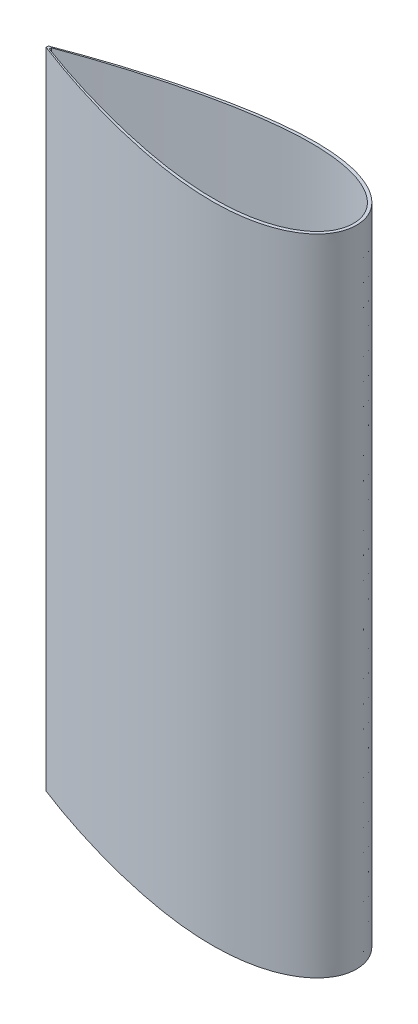
ISO-10303-21;
HEADER;
FILE_DESCRIPTION(('STEP AP214'),'2;1');
FILE_NAME('part.step','',(''),(''),'','','');
FILE_SCHEMA(('AUTOMOTIVE_DESIGN { 1 0 10303 214 1 1 1 1 }'));
ENDSEC;
DATA;
#1=APPLICATION_CONTEXT('core data for automotive mechanical design processes');
#2=APPLICATION_PROTOCOL_DEFINITION('international standard','automotive_design',2000,#1);
#3=PRODUCT_CONTEXT('',#1,'mechanical');
#4=PRODUCT('Part','Part','',(#3));
#5=PRODUCT_RELATED_PRODUCT_CATEGORY('part','',(#4));
#6=PRODUCT_DEFINITION_FORMATION('','',#4);
#7=PRODUCT_DEFINITION_CONTEXT('part definition',#1,'design');
#8=PRODUCT_DEFINITION('design','',#6,#7);
#9=PRODUCT_DEFINITION_SHAPE('','',#8);
#10=(LENGTH_UNIT() NAMED_UNIT(*) SI_UNIT(.MILLI.,.METRE.));
#11=(NAMED_UNIT(*) PLANE_ANGLE_UNIT() SI_UNIT($,.RADIAN.));
#12=(NAMED_UNIT(*) SI_UNIT($,.STERADIAN.) SOLID_ANGLE_UNIT());
#13=UNCERTAINTY_MEASURE_WITH_UNIT(LENGTH_MEASURE(1.E-05),#10,'distance_accuracy_value','');
#14=(GEOMETRIC_REPRESENTATION_CONTEXT(3) GLOBAL_UNCERTAINTY_ASSIGNED_CONTEXT((#13)) GLOBAL_UNIT_ASSIGNED_CONTEXT((#10,
#11,#12)) REPRESENTATION_CONTEXT('',''));
#15=CARTESIAN_POINT('',(0.,0.,0.));
#16=DIRECTION('',(0.,0.,1.));
#17=DIRECTION('',(1.,0.,0.));
#18=AXIS2_PLACEMENT_3D('',#15,#16,#17);
#19=CARTESIAN_POINT('',(-57.12,170.,0.285599999999995));
#20=CARTESIAN_POINT('',(-57.0455040447807,170.,0.314604205867027));
#21=CARTESIAN_POINT('',(-56.7485323708372,170.,0.430226960718439));
#22=CARTESIAN_POINT('',(-56.0834370859312,170.,0.687194926915187));
#23=CARTESIAN_POINT('',(-54.9830203449286,170.,1.10687746532345));
#24=CARTESIAN_POINT('',(-53.4591845655172,170.,1.67669100241537));
#25=CARTESIAN_POINT('',(-51.5285513298831,170.,2.38051048545914));
#26=CARTESIAN_POINT('',(-49.2121785972268,170.,3.19931332469481));
#27=CARTESIAN_POINT('',(-46.535401215014,170.,4.11224662244061));
#28=CARTESIAN_POINT('',(-43.5275397758018,170.,5.09732240051492));
#29=CARTESIAN_POINT('',(-40.2215821282518,170.,6.13190197270472));
#30=CARTESIAN_POINT('',(-36.6538039132951,170.,7.19283446637181));
#31=CARTESIAN_POINT('',(-32.8633476184003,170.,8.25632005064995));
#32=CARTESIAN_POINT('',(-28.8917637696992,170.,9.29759406218048));
#33=CARTESIAN_POINT('',(-24.7825243702763,170.,10.2905925714493));
#34=CARTESIAN_POINT('',(-20.5805179123394,170.,11.2077747794619));
#35=CARTESIAN_POINT('',(-16.3315368977414,170.,12.0202624725636));
#36=CARTESIAN_POINT('',(-12.0817693396444,170.,12.6984059872374));
#37=CARTESIAN_POINT('',(-7.87730513730122,170.,13.2128105385158));
#38=CARTESIAN_POINT('',(-3.7636652033935,170.,13.5357689250191));
#39=CARTESIAN_POINT('',(0.214645026823543,170.,13.642961665452));
#40=CARTESIAN_POINT('',(4.01456576560963,170.,13.5152167016279));
#41=CARTESIAN_POINT('',(7.59491598504345,170.,13.1400762984829));
#42=CARTESIAN_POINT('',(10.9168552641477,170.,12.5129021529628));
#43=CARTESIAN_POINT('',(13.9443886791298,170.,11.6372600366361));
#44=CARTESIAN_POINT('',(16.644881453109,170.,10.5243729582214));
#45=CARTESIAN_POINT('',(18.9894392117263,170.,9.19152180457931));
#46=CARTESIAN_POINT('',(20.9528399339452,170.,7.65953057210412));
#47=CARTESIAN_POINT('',(22.5125195427664,170.,5.94987780799117));
#48=CARTESIAN_POINT('',(23.6466567135729,170.,4.08331642952162));
#49=CARTESIAN_POINT('',(24.3333719851233,170.,2.08091678950326));
#50=CARTESIAN_POINT('',(24.5534114796255,170.,0.));
#51=CARTESIAN_POINT('',(24.3333719851234,170.,-2.08091678950323));
#52=CARTESIAN_POINT('',(23.6466567135729,170.,-4.08331642952163));
#53=CARTESIAN_POINT('',(22.5125195427664,170.,-5.94987780799118));
#54=CARTESIAN_POINT('',(20.9528399339452,170.,-7.65953057210411));
#55=CARTESIAN_POINT('',(18.9894392117263,170.,-9.19152180457931));
#56=CARTESIAN_POINT('',(16.644881453109,170.,-10.5243729582214));
#57=CARTESIAN_POINT('',(13.9443886791298,170.,-11.6372600366361));
#58=CARTESIAN_POINT('',(10.9168552641477,170.,-12.5129021529628));
#59=CARTESIAN_POINT('',(7.59491598504344,170.,-13.1400762984829));
#60=CARTESIAN_POINT('',(4.01456576560963,170.,-13.5152167016279));
#61=CARTESIAN_POINT('',(0.214645026823549,170.,-13.642961665452));
#62=CARTESIAN_POINT('',(-3.76366520339349,170.,-13.5357689250191));
#63=CARTESIAN_POINT('',(-7.87730513730124,170.,-13.2128105385158));
#64=CARTESIAN_POINT('',(-12.0817693396444,170.,-12.6984059872374));
#65=CARTESIAN_POINT('',(-16.3315368977414,170.,-12.0202624725636));
#66=CARTESIAN_POINT('',(-20.5805179123394,170.,-11.2077747794619));
#67=CARTESIAN_POINT('',(-24.7825243702763,170.,-10.2905925714493));
#68=CARTESIAN_POINT('',(-28.8917637696992,170.,-9.29759406218048));
#69=CARTESIAN_POINT('',(-32.8633476184003,170.,-8.25632005064995));
#70=CARTESIAN_POINT('',(-36.6538039132951,170.,-7.19283446637181));
#71=CARTESIAN_POINT('',(-40.2215821282518,170.,-6.13190197270473));
#72=CARTESIAN_POINT('',(-43.5275397758018,170.,-5.09732240051492));
#73=CARTESIAN_POINT('',(-46.535401215014,170.,-4.11224662244061));
#74=CARTESIAN_POINT('',(-49.2121785972268,170.,-3.1993133246948));
#75=CARTESIAN_POINT('',(-51.5285513298831,170.,-2.38051048545915));
#76=CARTESIAN_POINT('',(-53.4591845655172,170.,-1.67669100241537));
#77=CARTESIAN_POINT('',(-54.9830203449286,170.,-1.10687746532345));
#78=CARTESIAN_POINT('',(-56.0834370859312,170.,-0.687194926915175));
#79=CARTESIAN_POINT('',(-56.7485323708371,170.,-0.430226960718449));
#80=CARTESIAN_POINT('',(-57.0455040447808,170.,-0.314604205867027));
#81=CARTESIAN_POINT('',(-57.12,170.,-0.285599999999995));
#82=B_SPLINE_CURVE_WITH_KNOTS('',3,(#19,#20,#21,#22,#23,#24,#25,#26,#27,#28,#29,#30,#31,#32,#33,
#34,#35,#36,#37,#38,#39,#40,#41,#42,#43,#44,#45,#46,#47,#48,#49,#50,#51,#52,#53,#54,#55,#56,#57,
#58,#59,#60,#61,#62,#63,#64,#65,#66,#67,#68,#69,#70,#71,#72,#73,#74,#75,#76,#77,#78,#79,#80,
#81),.UNSPECIFIED.,.F.,.F.,(4,1,1,1,1,1,1,1,1,1,1,1,1,1,1,1,1,1,1,1,1,1,1,1,1,1,1,1,1,1,1,1,1,1,
1,1,1,1,1,1,1,1,1,1,1,1,1,1,1,1,1,1,1,1,1,1,1,1,1,1,4),(0.,0.00133550320219677,
0.00532386785760586,0.0119113049159635,0.0210102102683999,0.032501881486354,0.0462397187536872,
0.0620525024401402,0.0797474334350778,0.0991127820118181,0.119920173065211,0.141926699741709,
0.164877175844241,0.188506894471238,0.212545246994764,0.236720464663743,0.260765569827729,
0.284425373073179,0.307464060759566,0.329672653470025,0.350875479931116,0.370934915548274,
0.389754069606793,0.407277888700062,0.423494169030857,0.438436954355053,0.452195212433233,
0.464928581335463,0.476887756585074,0.488428514237328,0.5,0.511571485762672,0.523112243414925,
0.535071418664537,0.547804787566767,0.561563045644947,0.576505830969143,0.592722111299938,
0.610245930393206,0.629065084451725,0.649124520068884,0.670327346529975,0.692535939240434,
0.71557462692682,0.739234430172271,0.763279535336257,0.787454753005236,0.811493105528761,
0.835122824155759,0.85807330025829,0.880079826934789,0.900887217988182,0.920252566564922,
0.93794749755986,0.953760281246313,0.967498118513646,0.9789897897316,0.988088695084037,
0.994676132142394,0.998664496797803,1.),.UNSPECIFIED.);
#83=DIRECTION('',(0.,-1.,0.));
#84=VECTOR('',#83,1.);
#85=SURFACE_OF_LINEAR_EXTRUSION('',#82,#84);
#86=CARTESIAN_POINT('',(-57.12,0.,0.285599999999995));
#87=CARTESIAN_POINT('',(-57.0455040447807,0.,0.314604205867027));
#88=CARTESIAN_POINT('',(-56.7485323708372,0.,0.430226960718439));
#89=CARTESIAN_POINT('',(-56.0834370859312,0.,0.687194926915187));
#90=CARTESIAN_POINT('',(-54.9830203449286,0.,1.10687746532345));
#91=CARTESIAN_POINT('',(-53.4591845655172,0.,1.67669100241537));
#92=CARTESIAN_POINT('',(-51.5285513298831,0.,2.38051048545914));
#93=CARTESIAN_POINT('',(-49.2121785972268,0.,3.19931332469481));
#94=CARTESIAN_POINT('',(-46.535401215014,0.,4.11224662244061));
#95=CARTESIAN_POINT('',(-43.5275397758018,0.,5.09732240051492));
#96=CARTESIAN_POINT('',(-40.2215821282518,0.,6.13190197270472));
#97=CARTESIAN_POINT('',(-36.6538039132951,0.,7.19283446637181));
#98=CARTESIAN_POINT('',(-32.8633476184003,0.,8.25632005064995));
#99=CARTESIAN_POINT('',(-28.8917637696992,0.,9.29759406218048));
#100=CARTESIAN_POINT('',(-24.7825243702763,0.,10.2905925714493));
#101=CARTESIAN_POINT('',(-20.5805179123394,0.,11.2077747794619));
#102=CARTESIAN_POINT('',(-16.3315368977414,0.,12.0202624725636));
#103=CARTESIAN_POINT('',(-12.0817693396444,0.,12.6984059872374));
#104=CARTESIAN_POINT('',(-7.87730513730122,0.,13.2128105385158));
#105=CARTESIAN_POINT('',(-3.7636652033935,0.,13.5357689250191));
#106=CARTESIAN_POINT('',(0.214645026823543,0.,13.642961665452));
#107=CARTESIAN_POINT('',(4.01456576560963,0.,13.5152167016279));
#108=CARTESIAN_POINT('',(7.59491598504345,0.,13.1400762984829));
#109=CARTESIAN_POINT('',(10.9168552641477,0.,12.5129021529628));
#110=CARTESIAN_POINT('',(13.9443886791298,0.,11.6372600366361));
#111=CARTESIAN_POINT('',(16.644881453109,0.,10.5243729582214));
#112=CARTESIAN_POINT('',(18.9894392117263,0.,9.19152180457931));
#113=CARTESIAN_POINT('',(20.9528399339452,0.,7.65953057210412));
#114=CARTESIAN_POINT('',(22.5125195427664,0.,5.94987780799117));
#115=CARTESIAN_POINT('',(23.6466567135729,0.,4.08331642952162));
#116=CARTESIAN_POINT('',(24.3333719851233,0.,2.08091678950326));
#117=CARTESIAN_POINT('',(24.5534114796255,0.,0.));
#118=CARTESIAN_POINT('',(24.3333719851234,0.,-2.08091678950323));
#119=CARTESIAN_POINT('',(23.6466567135729,0.,-4.08331642952163));
#120=CARTESIAN_POINT('',(22.5125195427664,0.,-5.94987780799118));
#121=CARTESIAN_POINT('',(20.9528399339452,0.,-7.65953057210411));
#122=CARTESIAN_POINT('',(18.9894392117263,0.,-9.19152180457931));
#123=CARTESIAN_POINT('',(16.644881453109,0.,-10.5243729582214));
#124=CARTESIAN_POINT('',(13.9443886791298,0.,-11.6372600366361));
#125=CARTESIAN_POINT('',(10.9168552641477,0.,-12.5129021529628));
#126=CARTESIAN_POINT('',(7.59491598504344,0.,-13.1400762984829));
#127=CARTESIAN_POINT('',(4.01456576560963,0.,-13.5152167016279));
#128=CARTESIAN_POINT('',(0.214645026823549,0.,-13.642961665452));
#129=CARTESIAN_POINT('',(-3.76366520339349,0.,-13.5357689250191));
#130=CARTESIAN_POINT('',(-7.87730513730124,0.,-13.2128105385158));
#131=CARTESIAN_POINT('',(-12.0817693396444,0.,-12.6984059872374));
#132=CARTESIAN_POINT('',(-16.3315368977414,0.,-12.0202624725636));
#133=CARTESIAN_POINT('',(-20.5805179123394,0.,-11.2077747794619));
#134=CARTESIAN_POINT('',(-24.7825243702763,0.,-10.2905925714493));
#135=CARTESIAN_POINT('',(-28.8917637696992,0.,-9.29759406218048));
#136=CARTESIAN_POINT('',(-32.8633476184003,0.,-8.25632005064995));
#137=CARTESIAN_POINT('',(-36.6538039132951,0.,-7.19283446637181));
#138=CARTESIAN_POINT('',(-40.2215821282518,0.,-6.13190197270473));
#139=CARTESIAN_POINT('',(-43.5275397758018,0.,-5.09732240051492));
#140=CARTESIAN_POINT('',(-46.535401215014,0.,-4.11224662244061));
#141=CARTESIAN_POINT('',(-49.2121785972268,0.,-3.1993133246948));
#142=CARTESIAN_POINT('',(-51.5285513298831,0.,-2.38051048545915));
#143=CARTESIAN_POINT('',(-53.4591845655172,0.,-1.67669100241537));
#144=CARTESIAN_POINT('',(-54.9830203449286,0.,-1.10687746532345));
#145=CARTESIAN_POINT('',(-56.0834370859312,0.,-0.687194926915175));
#146=CARTESIAN_POINT('',(-56.7485323708371,0.,-0.430226960718449));
#147=CARTESIAN_POINT('',(-57.0455040447808,0.,-0.314604205867027));
#148=CARTESIAN_POINT('',(-57.12,0.,-0.285599999999995));
#149=B_SPLINE_CURVE_WITH_KNOTS('',3,(#86,#87,#88,#89,#90,#91,#92,#93,#94,#95,#96,#97,#98,#99,
#100,#101,#102,#103,#104,#105,#106,#107,#108,#109,#110,#111,#112,#113,#114,#115,#116,#117,#118,
#119,#120,#121,#122,#123,#124,#125,#126,#127,#128,#129,#130,#131,#132,#133,#134,#135,#136,#137,
#138,#139,#140,#141,#142,#143,#144,#145,#146,#147,#148),.UNSPECIFIED.,.F.,.F.,(4,1,1,1,1,1,1,1,
1,1,1,1,1,1,1,1,1,1,1,1,1,1,1,1,1,1,1,1,1,1,1,1,1,1,1,1,1,1,1,1,1,1,1,1,1,1,1,1,1,1,1,1,1,1,1,1,
1,1,1,1,4),(0.,0.00133550320219677,0.00532386785760586,0.0119113049159635,0.0210102102683999,
0.032501881486354,0.0462397187536872,0.0620525024401402,0.0797474334350778,0.0991127820118181,
0.119920173065211,0.141926699741709,0.164877175844241,0.188506894471238,0.212545246994764,
0.236720464663743,0.260765569827729,0.284425373073179,0.307464060759566,0.329672653470025,
0.350875479931116,0.370934915548274,0.389754069606793,0.407277888700062,0.423494169030857,
0.438436954355053,0.452195212433233,0.464928581335463,0.476887756585074,0.488428514237328,0.5,
0.511571485762672,0.523112243414925,0.535071418664537,0.547804787566767,0.561563045644947,
0.576505830969143,0.592722111299938,0.610245930393206,0.629065084451725,0.649124520068884,
0.670327346529975,0.692535939240434,0.71557462692682,0.739234430172271,0.763279535336257,
0.787454753005236,0.811493105528761,0.835122824155759,0.85807330025829,0.880079826934789,
0.900887217988182,0.920252566564922,0.93794749755986,0.953760281246313,0.967498118513646,
0.9789897897316,0.988088695084037,0.994676132142394,0.998664496797803,1.),.UNSPECIFIED.);
#150=CARTESIAN_POINT('',(-57.12,0.,0.285599999999995));
#151=VERTEX_POINT('',#150);
#152=CARTESIAN_POINT('',(-57.12,0.,-0.285599999999995));
#153=VERTEX_POINT('',#152);
#154=EDGE_CURVE('E82',#151,#153,#149,.T.);
#155=ORIENTED_EDGE('',*,*,#154,.T.);
#156=DIRECTION('',(0.,-1.,0.));
#157=VECTOR('',#156,1.);
#158=CARTESIAN_POINT('',(-57.12,170.,-0.285599999999995));
#159=LINE('',#158,#157);
#160=CARTESIAN_POINT('',(-57.12,170.,-0.285599999999995));
#161=VERTEX_POINT('',#160);
#162=EDGE_CURVE('E129',#161,#153,#159,.T.);
#163=ORIENTED_EDGE('',*,*,#162,.F.);
#164=CARTESIAN_POINT('',(-57.12,170.,0.285599999999995));
#165=VERTEX_POINT('',#164);
#166=EDGE_CURVE('E133',#165,#161,#82,.T.);
#167=ORIENTED_EDGE('',*,*,#166,.F.);
#168=DIRECTION('',(0.,-1.,0.));
#169=VECTOR('',#168,1.);
#170=CARTESIAN_POINT('',(-57.12,170.,0.285599999999995));
#171=LINE('',#170,#169);
#172=EDGE_CURVE('E126',#165,#151,#171,.T.);
#173=ORIENTED_EDGE('',*,*,#172,.T.);
#174=EDGE_LOOP('',(#155,#163,#167,#173));
#175=FACE_BOUND('',#174,.T.);
#176=ADVANCED_FACE('F39',(#175),#85,.F.);
#177=CARTESIAN_POINT('',(-57.12,170.,-0.285599999999995));
#178=DIRECTION('',(1.,0.,0.));
#179=DIRECTION('',(0.,0.,-1.));
#180=AXIS2_PLACEMENT_3D('',#177,#178,#179);
#181=PLANE('',#180);
#182=DIRECTION('',(0.,0.,1.));
#183=VECTOR('',#182,1.);
#184=CARTESIAN_POINT('',(-57.12,0.,-0.285599999999995));
#185=LINE('',#184,#183);
#186=EDGE_CURVE('E124',#153,#151,#185,.T.);
#187=ORIENTED_EDGE('',*,*,#186,.T.);
#188=ORIENTED_EDGE('',*,*,#172,.F.);
#189=DIRECTION('',(0.,0.,1.));
#190=VECTOR('',#189,1.);
#191=CARTESIAN_POINT('',(-57.12,170.,-0.285599999999995));
#192=LINE('',#191,#190);
#193=EDGE_CURVE('E136',#161,#165,#192,.T.);
#194=ORIENTED_EDGE('',*,*,#193,.F.);
#195=ORIENTED_EDGE('',*,*,#162,.T.);
#196=EDGE_LOOP('',(#187,#188,#194,#195));
#197=FACE_BOUND('',#196,.T.);
#198=ADVANCED_FACE('F113',(#197),#181,.F.);
#199=CARTESIAN_POINT('',(24.48,170.,0.));
#200=DIRECTION('',(0.,1.,0.));
#201=DIRECTION('',(0.,0.,1.));
#202=AXIS2_PLACEMENT_3D('',#199,#200,#201);
#203=PLANE('',#202);
#204=CARTESIAN_POINT('',(-56.32,170.,0.268799999999995));
#205=CARTESIAN_POINT('',(-56.2469643267356,170.,0.296098233405344));
#206=CARTESIAN_POINT('',(-55.9558007174297,170.,0.404925219051114));
#207=CARTESIAN_POINT('',(-55.3037102059169,170.,0.646790768471191));
#208=CARTESIAN_POINT('',(-54.2248114701945,170.,1.04180716533723));
#209=CARTESIAN_POINT('',(-52.7307841940299,170.,1.57812642792553));
#210=CARTESIAN_POINT('',(-50.8379295415583,170.,2.24056954333758));
#211=CARTESIAN_POINT('',(-48.5668996769928,170.,3.01123000352379));
#212=CARTESIAN_POINT('',(-45.9425365262148,170.,3.87048014740585));
#213=CARTESIAN_POINT('',(-42.9935870924287,170.,4.79762500452711));
#214=CARTESIAN_POINT('',(-39.7523908932478,170.,5.77135810332966));
#215=CARTESIAN_POINT('',(-36.254509087856,170.,6.76989123667013));
#216=CARTESIAN_POINT('',(-32.5383134252465,170.,7.77082510037512));
#217=CARTESIAN_POINT('',(-28.64453863481,170.,8.75085136212827));
#218=CARTESIAN_POINT('',(-24.6158078259284,170.,9.68543747202967));
#219=CARTESIAN_POINT('',(-20.4961397590271,170.,10.5486595027132));
#220=CARTESIAN_POINT('',(-16.3304482991971,170.,11.3133341333292));
#221=CARTESIAN_POINT('',(-12.1640447557857,170.,11.9515531424294));
#222=CARTESIAN_POINT('',(-8.0421530633333,170.,12.4356525393741));
#223=CARTESIAN_POINT('',(-4.00944468273404,170.,12.7395654659105));
#224=CARTESIAN_POINT('',(-0.109594077792035,170.,12.8404274150426));
#225=CARTESIAN_POINT('',(3.61515330462806,170.,12.7202366298925));
#226=CARTESIAN_POINT('',(7.12441847841279,170.,12.3673300093889));
#227=CARTESIAN_POINT('',(10.3801550778295,170.,11.7774193091131));
#228=CARTESIAN_POINT('',(13.347156980407,170.,10.9539425696467));
#229=CARTESIAN_POINT('',(15.9935780761944,170.,9.90752916755095));
#230=CARTESIAN_POINT('',(18.291330539946,170.,8.65444961027305));
#231=CARTESIAN_POINT('',(20.2160487195843,170.,7.21414493052177));
#232=CARTESIAN_POINT('',(21.7460357738055,170.,5.60630003138133));
#233=CARTESIAN_POINT('',(22.8600055729379,170.,3.84941987674208));
#234=CARTESIAN_POINT('',(23.5355429517609,170.,1.96238000337494));
#235=CARTESIAN_POINT('',(23.7521833975553,170.,0.));
#236=CARTESIAN_POINT('',(23.5355429517609,170.,-1.96238000337495));
#237=CARTESIAN_POINT('',(22.8600055729379,170.,-3.84941987674208));
#238=CARTESIAN_POINT('',(21.7460357738055,170.,-5.60630003138132));
#239=CARTESIAN_POINT('',(20.2160487195843,170.,-7.21414493052178));
#240=CARTESIAN_POINT('',(18.291330539946,170.,-8.65444961027304));
#241=CARTESIAN_POINT('',(15.9935780761944,170.,-9.90752916755096));
#242=CARTESIAN_POINT('',(13.347156980407,170.,-10.9539425696467));
#243=CARTESIAN_POINT('',(10.3801550778295,170.,-11.7774193091131));
#244=CARTESIAN_POINT('',(7.12441847841278,170.,-12.3673300093889));
#245=CARTESIAN_POINT('',(3.61515330462806,170.,-12.7202366298925));
#246=CARTESIAN_POINT('',(-0.109594077792035,170.,-12.8404274150426));
#247=CARTESIAN_POINT('',(-4.00944468273404,170.,-12.7395654659105));
#248=CARTESIAN_POINT('',(-8.04215306333332,170.,-12.4356525393741));
#249=CARTESIAN_POINT('',(-12.1640447557856,170.,-11.9515531424294));
#250=CARTESIAN_POINT('',(-16.3304482991971,170.,-11.3133341333292));
#251=CARTESIAN_POINT('',(-20.4961397590271,170.,-10.5486595027132));
#252=CARTESIAN_POINT('',(-24.6158078259285,170.,-9.68543747202967));
#253=CARTESIAN_POINT('',(-28.64453863481,170.,-8.75085136212827));
#254=CARTESIAN_POINT('',(-32.5383134252465,170.,-7.77082510037512));
#255=CARTESIAN_POINT('',(-36.254509087856,170.,-6.76989123667013));
#256=CARTESIAN_POINT('',(-39.7523908932478,170.,-5.77135810332966));
#257=CARTESIAN_POINT('',(-42.9935870924287,170.,-4.79762500452711));
#258=CARTESIAN_POINT('',(-45.9425365262148,170.,-3.87048014740585));
#259=CARTESIAN_POINT('',(-48.5668996769929,170.,-3.01123000352378));
#260=CARTESIAN_POINT('',(-50.8379295415583,170.,-2.24056954333759));
#261=CARTESIAN_POINT('',(-52.7307841940299,170.,-1.57812642792552));
#262=CARTESIAN_POINT('',(-54.2248114701945,170.,-1.04180716533723));
#263=CARTESIAN_POINT('',(-55.3037102059169,170.,-0.646790768471189));
#264=CARTESIAN_POINT('',(-55.9558007174297,170.,-0.404925219051116));
#265=CARTESIAN_POINT('',(-56.2469643267356,170.,-0.296098233405344));
#266=CARTESIAN_POINT('',(-56.32,170.,-0.268799999999995));
#267=B_SPLINE_CURVE_WITH_KNOTS('',3,(#204,#205,#206,#207,#208,#209,#210,#211,#212,#213,#214,
#215,#216,#217,#218,#219,#220,#221,#222,#223,#224,#225,#226,#227,#228,#229,#230,#231,#232,#233,
#234,#235,#236,#237,#238,#239,#240,#241,#242,#243,#244,#245,#246,#247,#248,#249,#250,#251,#252,
#253,#254,#255,#256,#257,#258,#259,#260,#261,#262,#263,#264,#265,#266),.UNSPECIFIED.,.F.,.F.,(4,
1,1,1,1,1,1,1,1,1,1,1,1,1,1,1,1,1,1,1,1,1,1,1,1,1,1,1,1,1,1,1,1,1,1,1,1,1,1,1,1,1,1,1,1,1,1,1,1,
1,1,1,1,1,1,1,1,1,1,1,4),(0.,0.00133611674248424,0.00532655558315043,0.0119181959671473,
0.0210244474721063,0.0325278380397668,0.0462830734824918,0.0621201871012511,0.0798474860476334,
0.0992541501884558,0.120112508826377,0.142180173086302,0.165202311217138,0.188914406241511,
0.213045821923661,0.23732441656672,0.261482280341632,0.285262438915698,0.308426097277885,
0.330759758539342,0.352081437401059,0.372245301226771,0.391144494826437,0.408712654680125,
0.424925602981025,0.43980569287493,0.453431792205325,0.465957010069139,0.477632115104227,
0.488823044997912,0.5,0.511176955002088,0.522367884895773,0.53404298993086,0.546568207794675,
0.56019430712507,0.575074397018975,0.591287345319875,0.608855505173562,0.627754698773229,
0.647918562598941,0.669240241460658,0.691573902722115,0.714737561084302,0.738517719658368,
0.762675583433279,0.786954178076339,0.811085593758489,0.834797688782861,0.857819826913697,
0.879887491173623,0.900745849811544,0.920152513952367,0.937879812898749,0.953716926517508,
0.967472161960233,0.978975552527894,0.988081804032853,0.99467344441685,0.998663883257516,1.),.UNSPECIFIED.);
#268=CARTESIAN_POINT('',(-56.32,170.,0.268799999999995));
#269=VERTEX_POINT('',#268);
#270=CARTESIAN_POINT('',(-56.32,170.,-0.268799999999995));
#271=VERTEX_POINT('',#270);
#272=EDGE_CURVE('E56',#269,#271,#267,.T.);
#273=ORIENTED_EDGE('',*,*,#272,.F.);
#274=DIRECTION('',(0.,0.,1.));
#275=VECTOR('',#274,1.);
#276=CARTESIAN_POINT('',(-56.32,170.,-0.268799999999995));
#277=LINE('',#276,#275);
#278=EDGE_CURVE('E86',#271,#269,#277,.T.);
#279=ORIENTED_EDGE('',*,*,#278,.F.);
#280=EDGE_LOOP('',(#273,#279));
#281=FACE_BOUND('',#280,.T.);
#282=ORIENTED_EDGE('',*,*,#166,.T.);
#283=ORIENTED_EDGE('',*,*,#193,.T.);
#284=EDGE_LOOP('',(#282,#283));
#285=FACE_BOUND('',#284,.T.);
#286=ADVANCED_FACE('F90',(#281,#285),#203,.T.);
#287=CARTESIAN_POINT('',(24.48,0.,0.));
#288=DIRECTION('',(0.,1.,0.));
#289=DIRECTION('',(0.,0.,1.));
#290=AXIS2_PLACEMENT_3D('',#287,#288,#289);
#291=PLANE('',#290);
#292=DIRECTION('',(0.,0.,1.));
#293=VECTOR('',#292,1.);
#294=CARTESIAN_POINT('',(-56.32,0.,0.));
#295=LINE('',#294,#293);
#296=CARTESIAN_POINT('',(-56.32,0.,-0.268799999999995));
#297=VERTEX_POINT('',#296);
#298=CARTESIAN_POINT('',(-56.32,0.,0.268799999999995));
#299=VERTEX_POINT('',#298);
#300=EDGE_CURVE('E49',#297,#299,#295,.T.);
#301=ORIENTED_EDGE('',*,*,#300,.T.);
#302=CARTESIAN_POINT('',(-56.32,0.,0.268799999999995));
#303=CARTESIAN_POINT('',(-56.2469643267356,0.,0.296098233405344));
#304=CARTESIAN_POINT('',(-55.9558007174297,0.,0.404925219051114));
#305=CARTESIAN_POINT('',(-55.3037102059169,0.,0.646790768471191));
#306=CARTESIAN_POINT('',(-54.2248114701945,0.,1.04180716533723));
#307=CARTESIAN_POINT('',(-52.7307841940299,0.,1.57812642792553));
#308=CARTESIAN_POINT('',(-50.8379295415583,0.,2.24056954333758));
#309=CARTESIAN_POINT('',(-48.5668996769928,0.,3.01123000352379));
#310=CARTESIAN_POINT('',(-45.9425365262148,0.,3.87048014740585));
#311=CARTESIAN_POINT('',(-42.9935870924287,0.,4.79762500452711));
#312=CARTESIAN_POINT('',(-39.7523908932478,0.,5.77135810332966));
#313=CARTESIAN_POINT('',(-36.254509087856,0.,6.76989123667013));
#314=CARTESIAN_POINT('',(-32.5383134252465,0.,7.77082510037512));
#315=CARTESIAN_POINT('',(-28.64453863481,0.,8.75085136212827));
#316=CARTESIAN_POINT('',(-24.6158078259284,0.,9.68543747202967));
#317=CARTESIAN_POINT('',(-20.4961397590271,0.,10.5486595027132));
#318=CARTESIAN_POINT('',(-16.3304482991971,0.,11.3133341333292));
#319=CARTESIAN_POINT('',(-12.1640447557857,0.,11.9515531424294));
#320=CARTESIAN_POINT('',(-8.0421530633333,0.,12.4356525393741));
#321=CARTESIAN_POINT('',(-4.00944468273404,0.,12.7395654659105));
#322=CARTESIAN_POINT('',(-0.109594077792035,0.,12.8404274150426));
#323=CARTESIAN_POINT('',(3.61515330462806,0.,12.7202366298925));
#324=CARTESIAN_POINT('',(7.12441847841279,0.,12.3673300093889));
#325=CARTESIAN_POINT('',(10.3801550778295,0.,11.7774193091131));
#326=CARTESIAN_POINT('',(13.347156980407,0.,10.9539425696467));
#327=CARTESIAN_POINT('',(15.9935780761944,0.,9.90752916755095));
#328=CARTESIAN_POINT('',(18.291330539946,0.,8.65444961027305));
#329=CARTESIAN_POINT('',(20.2160487195843,0.,7.21414493052177));
#330=CARTESIAN_POINT('',(21.7460357738055,0.,5.60630003138133));
#331=CARTESIAN_POINT('',(22.8600055729379,0.,3.84941987674208));
#332=CARTESIAN_POINT('',(23.5355429517609,0.,1.96238000337494));
#333=CARTESIAN_POINT('',(23.7521833975553,0.,0.));
#334=CARTESIAN_POINT('',(23.5355429517609,0.,-1.96238000337495));
#335=CARTESIAN_POINT('',(22.8600055729379,0.,-3.84941987674208));
#336=CARTESIAN_POINT('',(21.7460357738055,0.,-5.60630003138132));
#337=CARTESIAN_POINT('',(20.2160487195843,0.,-7.21414493052178));
#338=CARTESIAN_POINT('',(18.291330539946,0.,-8.65444961027304));
#339=CARTESIAN_POINT('',(15.9935780761944,0.,-9.90752916755096));
#340=CARTESIAN_POINT('',(13.347156980407,0.,-10.9539425696467));
#341=CARTESIAN_POINT('',(10.3801550778295,0.,-11.7774193091131));
#342=CARTESIAN_POINT('',(7.12441847841278,0.,-12.3673300093889));
#343=CARTESIAN_POINT('',(3.61515330462806,0.,-12.7202366298925));
#344=CARTESIAN_POINT('',(-0.109594077792035,0.,-12.8404274150426));
#345=CARTESIAN_POINT('',(-4.00944468273404,0.,-12.7395654659105));
#346=CARTESIAN_POINT('',(-8.04215306333332,0.,-12.4356525393741));
#347=CARTESIAN_POINT('',(-12.1640447557856,0.,-11.9515531424294));
#348=CARTESIAN_POINT('',(-16.3304482991971,0.,-11.3133341333292));
#349=CARTESIAN_POINT('',(-20.4961397590271,0.,-10.5486595027132));
#350=CARTESIAN_POINT('',(-24.6158078259285,0.,-9.68543747202967));
#351=CARTESIAN_POINT('',(-28.64453863481,0.,-8.75085136212827));
#352=CARTESIAN_POINT('',(-32.5383134252465,0.,-7.77082510037512));
#353=CARTESIAN_POINT('',(-36.254509087856,0.,-6.76989123667013));
#354=CARTESIAN_POINT('',(-39.7523908932478,0.,-5.77135810332966));
#355=CARTESIAN_POINT('',(-42.9935870924287,0.,-4.79762500452711));
#356=CARTESIAN_POINT('',(-45.9425365262148,0.,-3.87048014740585));
#357=CARTESIAN_POINT('',(-48.5668996769929,0.,-3.01123000352378));
#358=CARTESIAN_POINT('',(-50.8379295415583,0.,-2.24056954333759));
#359=CARTESIAN_POINT('',(-52.7307841940299,0.,-1.57812642792552));
#360=CARTESIAN_POINT('',(-54.2248114701945,0.,-1.04180716533723));
#361=CARTESIAN_POINT('',(-55.3037102059169,0.,-0.646790768471189));
#362=CARTESIAN_POINT('',(-55.9558007174297,0.,-0.404925219051116));
#363=CARTESIAN_POINT('',(-56.2469643267356,0.,-0.296098233405344));
#364=CARTESIAN_POINT('',(-56.32,0.,-0.268799999999995));
#365=B_SPLINE_CURVE_WITH_KNOTS('',3,(#302,#303,#304,#305,#306,#307,#308,#309,#310,#311,#312,
#313,#314,#315,#316,#317,#318,#319,#320,#321,#322,#323,#324,#325,#326,#327,#328,#329,#330,#331,
#332,#333,#334,#335,#336,#337,#338,#339,#340,#341,#342,#343,#344,#345,#346,#347,#348,#349,#350,
#351,#352,#353,#354,#355,#356,#357,#358,#359,#360,#361,#362,#363,#364),.UNSPECIFIED.,.F.,.F.,(4,
1,1,1,1,1,1,1,1,1,1,1,1,1,1,1,1,1,1,1,1,1,1,1,1,1,1,1,1,1,1,1,1,1,1,1,1,1,1,1,1,1,1,1,1,1,1,1,1,
1,1,1,1,1,1,1,1,1,1,1,4),(0.,0.00133611674248424,0.00532655558315043,0.0119181959671473,
0.0210244474721063,0.0325278380397668,0.0462830734824918,0.0621201871012511,0.0798474860476334,
0.0992541501884558,0.120112508826377,0.142180173086302,0.165202311217138,0.188914406241511,
0.213045821923661,0.23732441656672,0.261482280341632,0.285262438915698,0.308426097277885,
0.330759758539342,0.352081437401059,0.372245301226771,0.391144494826437,0.408712654680125,
0.424925602981025,0.43980569287493,0.453431792205325,0.465957010069139,0.477632115104227,
0.488823044997912,0.5,0.511176955002088,0.522367884895773,0.53404298993086,0.546568207794675,
0.56019430712507,0.575074397018975,0.591287345319875,0.608855505173562,0.627754698773229,
0.647918562598941,0.669240241460658,0.691573902722115,0.714737561084302,0.738517719658368,
0.762675583433279,0.786954178076339,0.811085593758489,0.834797688782861,0.857819826913697,
0.879887491173623,0.900745849811544,0.920152513952367,0.937879812898749,0.953716926517508,
0.967472161960233,0.978975552527894,0.988081804032853,0.99467344441685,0.998663883257516,1.),.UNSPECIFIED.);
#366=EDGE_CURVE('E11',#299,#297,#365,.T.);
#367=ORIENTED_EDGE('',*,*,#366,.T.);
#368=EDGE_LOOP('',(#301,#367));
#369=FACE_BOUND('',#368,.T.);
#370=ORIENTED_EDGE('',*,*,#154,.F.);
#371=ORIENTED_EDGE('',*,*,#186,.F.);
#372=EDGE_LOOP('',(#370,#371));
#373=FACE_BOUND('',#372,.T.);
#374=ADVANCED_FACE('F110',(#369,#373),#291,.F.);
#375=CARTESIAN_POINT('',(-56.32,-1.2E-05,0.268799999999995));
#376=CARTESIAN_POINT('',(-56.2469643267356,-1.2E-05,0.296098233405344));
#377=CARTESIAN_POINT('',(-55.9558007174297,-1.2E-05,0.404925219051114));
#378=CARTESIAN_POINT('',(-55.3037102059169,-1.2E-05,0.646790768471191));
#379=CARTESIAN_POINT('',(-54.2248114701945,-1.2E-05,1.04180716533723));
#380=CARTESIAN_POINT('',(-52.7307841940299,-1.2E-05,1.57812642792553));
#381=CARTESIAN_POINT('',(-50.8379295415583,-1.2E-05,2.24056954333758));
#382=CARTESIAN_POINT('',(-48.5668996769928,-1.2E-05,3.01123000352379));
#383=CARTESIAN_POINT('',(-45.9425365262148,-1.2E-05,3.87048014740585));
#384=CARTESIAN_POINT('',(-42.9935870924287,-1.2E-05,4.79762500452711));
#385=CARTESIAN_POINT('',(-39.7523908932478,-1.2E-05,5.77135810332966));
#386=CARTESIAN_POINT('',(-36.254509087856,-1.2E-05,6.76989123667013));
#387=CARTESIAN_POINT('',(-32.5383134252465,-1.2E-05,7.77082510037512));
#388=CARTESIAN_POINT('',(-28.64453863481,-1.2E-05,8.75085136212827));
#389=CARTESIAN_POINT('',(-24.6158078259284,-1.2E-05,9.68543747202967));
#390=CARTESIAN_POINT('',(-20.4961397590271,-1.2E-05,10.5486595027132));
#391=CARTESIAN_POINT('',(-16.3304482991971,-1.2E-05,11.3133341333292));
#392=CARTESIAN_POINT('',(-12.1640447557857,-1.2E-05,11.9515531424294));
#393=CARTESIAN_POINT('',(-8.0421530633333,-1.2E-05,12.4356525393741));
#394=CARTESIAN_POINT('',(-4.00944468273404,-1.2E-05,12.7395654659105));
#395=CARTESIAN_POINT('',(-0.109594077792035,-1.2E-05,12.8404274150426));
#396=CARTESIAN_POINT('',(3.61515330462806,-1.2E-05,12.7202366298925));
#397=CARTESIAN_POINT('',(7.12441847841279,-1.2E-05,12.3673300093889));
#398=CARTESIAN_POINT('',(10.3801550778295,-1.2E-05,11.7774193091131));
#399=CARTESIAN_POINT('',(13.347156980407,-1.2E-05,10.9539425696467));
#400=CARTESIAN_POINT('',(15.9935780761944,-1.2E-05,9.90752916755095));
#401=CARTESIAN_POINT('',(18.291330539946,-1.2E-05,8.65444961027305));
#402=CARTESIAN_POINT('',(20.2160487195843,-1.2E-05,7.21414493052177));
#403=CARTESIAN_POINT('',(21.7460357738055,-1.2E-05,5.60630003138133));
#404=CARTESIAN_POINT('',(22.8600055729379,-1.2E-05,3.84941987674208));
#405=CARTESIAN_POINT('',(23.5355429517609,-1.2E-05,1.96238000337494));
#406=CARTESIAN_POINT('',(23.7521833975553,-1.2E-05,0.));
#407=CARTESIAN_POINT('',(23.5355429517609,-1.2E-05,-1.96238000337495));
#408=CARTESIAN_POINT('',(22.8600055729379,-1.2E-05,-3.84941987674208));
#409=CARTESIAN_POINT('',(21.7460357738055,-1.2E-05,-5.60630003138132));
#410=CARTESIAN_POINT('',(20.2160487195843,-1.2E-05,-7.21414493052178));
#411=CARTESIAN_POINT('',(18.291330539946,-1.2E-05,-8.65444961027304));
#412=CARTESIAN_POINT('',(15.9935780761944,-1.2E-05,-9.90752916755096));
#413=CARTESIAN_POINT('',(13.347156980407,-1.2E-05,-10.9539425696467));
#414=CARTESIAN_POINT('',(10.3801550778295,-1.2E-05,-11.7774193091131));
#415=CARTESIAN_POINT('',(7.12441847841278,-1.2E-05,-12.3673300093889));
#416=CARTESIAN_POINT('',(3.61515330462806,-1.2E-05,-12.7202366298925));
#417=CARTESIAN_POINT('',(-0.109594077792035,-1.2E-05,-12.8404274150426));
#418=CARTESIAN_POINT('',(-4.00944468273404,-1.2E-05,-12.7395654659105));
#419=CARTESIAN_POINT('',(-8.04215306333332,-1.2E-05,-12.4356525393741));
#420=CARTESIAN_POINT('',(-12.1640447557856,-1.2E-05,-11.9515531424294));
#421=CARTESIAN_POINT('',(-16.3304482991971,-1.2E-05,-11.3133341333292));
#422=CARTESIAN_POINT('',(-20.4961397590271,-1.2E-05,-10.5486595027132));
#423=CARTESIAN_POINT('',(-24.6158078259285,-1.2E-05,-9.68543747202967));
#424=CARTESIAN_POINT('',(-28.64453863481,-1.2E-05,-8.75085136212827));
#425=CARTESIAN_POINT('',(-32.5383134252465,-1.2E-05,-7.77082510037512));
#426=CARTESIAN_POINT('',(-36.254509087856,-1.2E-05,-6.76989123667013));
#427=CARTESIAN_POINT('',(-39.7523908932478,-1.2E-05,-5.77135810332966));
#428=CARTESIAN_POINT('',(-42.9935870924287,-1.2E-05,-4.79762500452711));
#429=CARTESIAN_POINT('',(-45.9425365262148,-1.2E-05,-3.87048014740585));
#430=CARTESIAN_POINT('',(-48.5668996769929,-1.2E-05,-3.01123000352378));
#431=CARTESIAN_POINT('',(-50.8379295415583,-1.2E-05,-2.24056954333759));
#432=CARTESIAN_POINT('',(-52.7307841940299,-1.2E-05,-1.57812642792552));
#433=CARTESIAN_POINT('',(-54.2248114701945,-1.2E-05,-1.04180716533723));
#434=CARTESIAN_POINT('',(-55.3037102059169,-1.2E-05,-0.646790768471189));
#435=CARTESIAN_POINT('',(-55.9558007174297,-1.2E-05,-0.404925219051116));
#436=CARTESIAN_POINT('',(-56.2469643267356,-1.2E-05,-0.296098233405344));
#437=CARTESIAN_POINT('',(-56.32,-1.2E-05,-0.268799999999995));
#438=B_SPLINE_CURVE_WITH_KNOTS('',3,(#375,#376,#377,#378,#379,#380,#381,#382,#383,#384,#385,
#386,#387,#388,#389,#390,#391,#392,#393,#394,#395,#396,#397,#398,#399,#400,#401,#402,#403,#404,
#405,#406,#407,#408,#409,#410,#411,#412,#413,#414,#415,#416,#417,#418,#419,#420,#421,#422,#423,
#424,#425,#426,#427,#428,#429,#430,#431,#432,#433,#434,#435,#436,#437),.UNSPECIFIED.,.F.,.F.,(4,
1,1,1,1,1,1,1,1,1,1,1,1,1,1,1,1,1,1,1,1,1,1,1,1,1,1,1,1,1,1,1,1,1,1,1,1,1,1,1,1,1,1,1,1,1,1,1,1,
1,1,1,1,1,1,1,1,1,1,1,4),(0.,0.00133611674248424,0.00532655558315043,0.0119181959671473,
0.0210244474721063,0.0325278380397668,0.0462830734824918,0.0621201871012511,0.0798474860476334,
0.0992541501884558,0.120112508826377,0.142180173086302,0.165202311217138,0.188914406241511,
0.213045821923661,0.23732441656672,0.261482280341632,0.285262438915698,0.308426097277885,
0.330759758539342,0.352081437401059,0.372245301226771,0.391144494826437,0.408712654680125,
0.424925602981025,0.43980569287493,0.453431792205325,0.465957010069139,0.477632115104227,
0.488823044997912,0.5,0.511176955002088,0.522367884895773,0.53404298993086,0.546568207794675,
0.56019430712507,0.575074397018975,0.591287345319875,0.608855505173562,0.627754698773229,
0.647918562598941,0.669240241460658,0.691573902722115,0.714737561084302,0.738517719658368,
0.762675583433279,0.786954178076339,0.811085593758489,0.834797688782861,0.857819826913697,
0.879887491173623,0.900745849811544,0.920152513952367,0.937879812898749,0.953716926517508,
0.967472161960233,0.978975552527894,0.988081804032853,0.99467344441685,0.998663883257516,1.),.UNSPECIFIED.);
#439=DIRECTION('',(0.,1.,0.));
#440=VECTOR('',#439,1.);
#441=SURFACE_OF_LINEAR_EXTRUSION('',#438,#440);
#442=DIRECTION('',(0.,1.,0.));
#443=VECTOR('',#442,1.);
#444=CARTESIAN_POINT('',(-56.32,-1.2E-05,0.268799999999995));
#445=LINE('',#444,#443);
#446=EDGE_CURVE('E63',#299,#269,#445,.T.);
#447=ORIENTED_EDGE('',*,*,#446,.T.);
#448=ORIENTED_EDGE('',*,*,#272,.T.);
#449=DIRECTION('',(0.,1.,0.));
#450=VECTOR('',#449,1.);
#451=CARTESIAN_POINT('',(-56.32,-1.2E-05,-0.268799999999995));
#452=LINE('',#451,#450);
#453=EDGE_CURVE('E83',#297,#271,#452,.T.);
#454=ORIENTED_EDGE('',*,*,#453,.F.);
#455=ORIENTED_EDGE('',*,*,#366,.F.);
#456=EDGE_LOOP('',(#447,#448,#454,#455));
#457=FACE_BOUND('',#456,.T.);
#458=ADVANCED_FACE('F80',(#457),#441,.F.);
#459=CARTESIAN_POINT('',(-56.32,-1.2E-05,-0.268799999999995));
#460=DIRECTION('',(-1.,0.,0.));
#461=DIRECTION('',(0.,0.,1.));
#462=AXIS2_PLACEMENT_3D('',#459,#460,#461);
#463=PLANE('',#462);
#464=ORIENTED_EDGE('',*,*,#453,.T.);
#465=ORIENTED_EDGE('',*,*,#278,.T.);
#466=ORIENTED_EDGE('',*,*,#446,.F.);
#467=ORIENTED_EDGE('',*,*,#300,.F.);
#468=EDGE_LOOP('',(#464,#465,#466,#467));
#469=FACE_BOUND('',#468,.T.);
#470=ADVANCED_FACE('F87',(#469),#463,.F.);
#471=CLOSED_SHELL('',(#176,#198,#286,#374,#458,#470));
#472=MANIFOLD_SOLID_BREP('B2',#471);
#473=ADVANCED_BREP_SHAPE_REPRESENTATION('',(#18,#472),#14);
#474=SHAPE_DEFINITION_REPRESENTATION(#9,#473);
ENDSEC;
END-ISO-10303-21;
